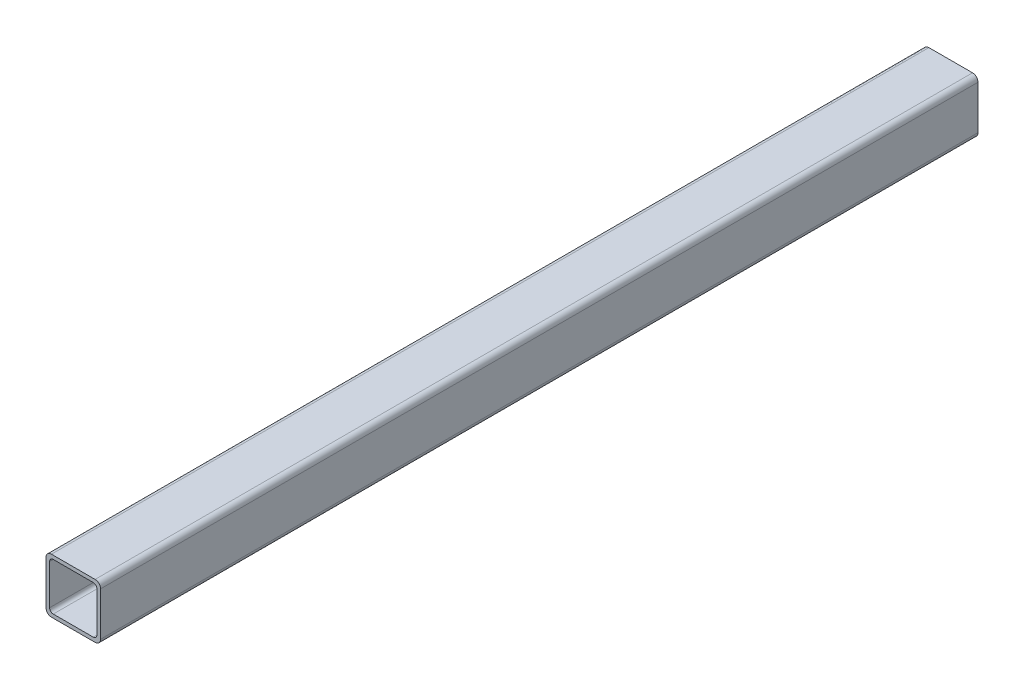
ISO-10303-21;
HEADER;
FILE_DESCRIPTION(('STEP AP214'),'2;1');
FILE_NAME('part.step','',(''),(''),'','','');
FILE_SCHEMA(('AUTOMOTIVE_DESIGN { 1 0 10303 214 1 1 1 1 }'));
ENDSEC;
DATA;
#1=APPLICATION_CONTEXT('core data for automotive mechanical design processes');
#2=APPLICATION_PROTOCOL_DEFINITION('international standard','automotive_design',2000,#1);
#3=PRODUCT_CONTEXT('',#1,'mechanical');
#4=PRODUCT('Part','Part','',(#3));
#5=PRODUCT_RELATED_PRODUCT_CATEGORY('part','',(#4));
#6=PRODUCT_DEFINITION_FORMATION('','',#4);
#7=PRODUCT_DEFINITION_CONTEXT('part definition',#1,'design');
#8=PRODUCT_DEFINITION('design','',#6,#7);
#9=PRODUCT_DEFINITION_SHAPE('','',#8);
#10=(LENGTH_UNIT() NAMED_UNIT(*) SI_UNIT(.MILLI.,.METRE.));
#11=(NAMED_UNIT(*) PLANE_ANGLE_UNIT() SI_UNIT($,.RADIAN.));
#12=(NAMED_UNIT(*) SI_UNIT($,.STERADIAN.) SOLID_ANGLE_UNIT());
#13=UNCERTAINTY_MEASURE_WITH_UNIT(LENGTH_MEASURE(1.E-05),#10,'distance_accuracy_value','');
#14=(GEOMETRIC_REPRESENTATION_CONTEXT(3) GLOBAL_UNCERTAINTY_ASSIGNED_CONTEXT((#13)) GLOBAL_UNIT_ASSIGNED_CONTEXT((#10,
#11,#12)) REPRESENTATION_CONTEXT('',''));
#15=CARTESIAN_POINT('',(0.,0.,0.));
#16=DIRECTION('',(0.,0.,1.));
#17=DIRECTION('',(1.,0.,0.));
#18=AXIS2_PLACEMENT_3D('',#15,#16,#17);
#19=CARTESIAN_POINT('',(-27.,-27.,-482.500000000008));
#20=DIRECTION('',(0.,0.,1.));
#21=DIRECTION('',(1.,0.,0.));
#22=AXIS2_PLACEMENT_3D('',#19,#20,#21);
#23=CYLINDRICAL_SURFACE('',#22,3.);
#24=CARTESIAN_POINT('',(-27.,-27.,0.));
#25=DIRECTION('',(0.,0.,1.));
#26=DIRECTION('',(1.,0.,0.));
#27=AXIS2_PLACEMENT_3D('',#24,#25,#26);
#28=CIRCLE('',#27,3.);
#29=CARTESIAN_POINT('',(-30.,-27.,0.));
#30=VERTEX_POINT('',#29);
#31=CARTESIAN_POINT('',(-27.,-30.,0.));
#32=VERTEX_POINT('',#31);
#33=EDGE_CURVE('E205',#30,#32,#28,.T.);
#34=ORIENTED_EDGE('',*,*,#33,.F.);
#35=DIRECTION('',(0.,0.,1.));
#36=VECTOR('',#35,1.);
#37=CARTESIAN_POINT('',(-30.,-27.,-482.500000000008));
#38=LINE('',#37,#36);
#39=CARTESIAN_POINT('',(-30.,-27.,-482.500000000008));
#40=VERTEX_POINT('',#39);
#41=EDGE_CURVE('E11',#40,#30,#38,.T.);
#42=ORIENTED_EDGE('',*,*,#41,.F.);
#43=CARTESIAN_POINT('',(-27.,-27.,-482.500000000008));
#44=DIRECTION('',(0.,0.,1.));
#45=DIRECTION('',(1.,0.,0.));
#46=AXIS2_PLACEMENT_3D('',#43,#44,#45);
#47=CIRCLE('',#46,3.);
#48=CARTESIAN_POINT('',(-27.,-30.,-482.500000000008));
#49=VERTEX_POINT('',#48);
#50=EDGE_CURVE('E217',#40,#49,#47,.T.);
#51=ORIENTED_EDGE('',*,*,#50,.T.);
#52=DIRECTION('',(0.,0.,1.));
#53=VECTOR('',#52,1.);
#54=CARTESIAN_POINT('',(-27.,-30.,-482.500000000008));
#55=LINE('',#54,#53);
#56=EDGE_CURVE('E38',#49,#32,#55,.T.);
#57=ORIENTED_EDGE('',*,*,#56,.T.);
#58=EDGE_LOOP('',(#34,#42,#51,#57));
#59=FACE_BOUND('',#58,.T.);
#60=ADVANCED_FACE('F35',(#59),#23,.T.);
#61=CARTESIAN_POINT('',(-30.,-3.00000000000002,-482.500000000008));
#62=DIRECTION('',(-1.,0.,0.));
#63=DIRECTION('',(0.,0.,1.));
#64=AXIS2_PLACEMENT_3D('',#61,#62,#63);
#65=PLANE('',#64);
#66=DIRECTION('',(0.,-1.,0.));
#67=VECTOR('',#66,1.);
#68=CARTESIAN_POINT('',(-30.,-3.00000000000002,0.));
#69=LINE('',#68,#67);
#70=CARTESIAN_POINT('',(-30.,-3.00000000000002,0.));
#71=VERTEX_POINT('',#70);
#72=EDGE_CURVE('E221',#71,#30,#69,.T.);
#73=ORIENTED_EDGE('',*,*,#72,.F.);
#74=DIRECTION('',(0.,0.,1.));
#75=VECTOR('',#74,1.);
#76=CARTESIAN_POINT('',(-30.,-3.00000000000002,-482.500000000008));
#77=LINE('',#76,#75);
#78=CARTESIAN_POINT('',(-30.,-3.00000000000002,-482.500000000008));
#79=VERTEX_POINT('',#78);
#80=EDGE_CURVE('E43',#79,#71,#77,.T.);
#81=ORIENTED_EDGE('',*,*,#80,.F.);
#82=DIRECTION('',(0.,-1.,0.));
#83=VECTOR('',#82,1.);
#84=CARTESIAN_POINT('',(-30.,-3.00000000000002,-482.500000000008));
#85=LINE('',#84,#83);
#86=EDGE_CURVE('E239',#79,#40,#85,.T.);
#87=ORIENTED_EDGE('',*,*,#86,.T.);
#88=ORIENTED_EDGE('',*,*,#41,.T.);
#89=EDGE_LOOP('',(#73,#81,#87,#88));
#90=FACE_BOUND('',#89,.T.);
#91=ADVANCED_FACE('F286',(#90),#65,.T.);
#92=CARTESIAN_POINT('',(-27.,-3.,-482.500000000008));
#93=DIRECTION('',(0.,0.,1.));
#94=DIRECTION('',(1.,0.,0.));
#95=AXIS2_PLACEMENT_3D('',#92,#93,#94);
#96=CYLINDRICAL_SURFACE('',#95,3.);
#97=CARTESIAN_POINT('',(-27.,-3.,0.));
#98=DIRECTION('',(0.,0.,1.));
#99=DIRECTION('',(1.,0.,0.));
#100=AXIS2_PLACEMENT_3D('',#97,#98,#99);
#101=CIRCLE('',#100,3.);
#102=CARTESIAN_POINT('',(-27.,0.,0.));
#103=VERTEX_POINT('',#102);
#104=EDGE_CURVE('E259',#103,#71,#101,.T.);
#105=ORIENTED_EDGE('',*,*,#104,.F.);
#106=DIRECTION('',(0.,0.,1.));
#107=VECTOR('',#106,1.);
#108=CARTESIAN_POINT('',(-27.,0.,-482.500000000008));
#109=LINE('',#108,#107);
#110=CARTESIAN_POINT('',(-27.,0.,-482.500000000008));
#111=VERTEX_POINT('',#110);
#112=EDGE_CURVE('E265',#111,#103,#109,.T.);
#113=ORIENTED_EDGE('',*,*,#112,.F.);
#114=CARTESIAN_POINT('',(-27.,-3.,-482.500000000008));
#115=DIRECTION('',(0.,0.,1.));
#116=DIRECTION('',(1.,0.,0.));
#117=AXIS2_PLACEMENT_3D('',#114,#115,#116);
#118=CIRCLE('',#117,3.);
#119=EDGE_CURVE('E236',#111,#79,#118,.T.);
#120=ORIENTED_EDGE('',*,*,#119,.T.);
#121=ORIENTED_EDGE('',*,*,#80,.T.);
#122=EDGE_LOOP('',(#105,#113,#120,#121));
#123=FACE_BOUND('',#122,.T.);
#124=ADVANCED_FACE('F305',(#123),#96,.T.);
#125=CARTESIAN_POINT('',(-27.,0.,-482.500000000008));
#126=DIRECTION('',(0.,1.,0.));
#127=DIRECTION('',(0.,0.,1.));
#128=AXIS2_PLACEMENT_3D('',#125,#126,#127);
#129=PLANE('',#128);
#130=DIRECTION('',(-1.,0.,0.));
#131=VECTOR('',#130,1.);
#132=CARTESIAN_POINT('',(-27.,0.,0.));
#133=LINE('',#132,#131);
#134=CARTESIAN_POINT('',(-3.,0.,0.));
#135=VERTEX_POINT('',#134);
#136=EDGE_CURVE('E256',#135,#103,#133,.T.);
#137=ORIENTED_EDGE('',*,*,#136,.F.);
#138=DIRECTION('',(0.,0.,1.));
#139=VECTOR('',#138,1.);
#140=CARTESIAN_POINT('',(-3.,0.,-482.500000000008));
#141=LINE('',#140,#139);
#142=CARTESIAN_POINT('',(-3.,0.,-482.500000000008));
#143=VERTEX_POINT('',#142);
#144=EDGE_CURVE('E267',#143,#135,#141,.T.);
#145=ORIENTED_EDGE('',*,*,#144,.F.);
#146=DIRECTION('',(-1.,0.,0.));
#147=VECTOR('',#146,1.);
#148=CARTESIAN_POINT('',(-27.,0.,-482.500000000008));
#149=LINE('',#148,#147);
#150=EDGE_CURVE('E233',#143,#111,#149,.T.);
#151=ORIENTED_EDGE('',*,*,#150,.T.);
#152=ORIENTED_EDGE('',*,*,#112,.T.);
#153=EDGE_LOOP('',(#137,#145,#151,#152));
#154=FACE_BOUND('',#153,.T.);
#155=ADVANCED_FACE('F303',(#154),#129,.T.);
#156=CARTESIAN_POINT('',(-3.,-3.,-482.500000000008));
#157=DIRECTION('',(0.,0.,1.));
#158=DIRECTION('',(1.,0.,0.));
#159=AXIS2_PLACEMENT_3D('',#156,#157,#158);
#160=CYLINDRICAL_SURFACE('',#159,3.);
#161=CARTESIAN_POINT('',(-3.,-3.,0.));
#162=DIRECTION('',(0.,0.,1.));
#163=DIRECTION('',(-1.,0.,0.));
#164=AXIS2_PLACEMENT_3D('',#161,#162,#163);
#165=CIRCLE('',#164,3.);
#166=CARTESIAN_POINT('',(0.,-3.,0.));
#167=VERTEX_POINT('',#166);
#168=EDGE_CURVE('E253',#167,#135,#165,.T.);
#169=ORIENTED_EDGE('',*,*,#168,.F.);
#170=DIRECTION('',(0.,0.,1.));
#171=VECTOR('',#170,1.);
#172=CARTESIAN_POINT('',(0.,-3.,-482.500000000008));
#173=LINE('',#172,#171);
#174=CARTESIAN_POINT('',(0.,-3.,-482.500000000008));
#175=VERTEX_POINT('',#174);
#176=EDGE_CURVE('E269',#175,#167,#173,.T.);
#177=ORIENTED_EDGE('',*,*,#176,.F.);
#178=CARTESIAN_POINT('',(-3.,-3.,-482.500000000008));
#179=DIRECTION('',(0.,0.,1.));
#180=DIRECTION('',(-1.,0.,0.));
#181=AXIS2_PLACEMENT_3D('',#178,#179,#180);
#182=CIRCLE('',#181,3.);
#183=EDGE_CURVE('E230',#175,#143,#182,.T.);
#184=ORIENTED_EDGE('',*,*,#183,.T.);
#185=ORIENTED_EDGE('',*,*,#144,.T.);
#186=EDGE_LOOP('',(#169,#177,#184,#185));
#187=FACE_BOUND('',#186,.T.);
#188=ADVANCED_FACE('F299',(#187),#160,.T.);
#189=CARTESIAN_POINT('',(0.,-3.,-482.500000000008));
#190=DIRECTION('',(1.,0.,0.));
#191=DIRECTION('',(0.,1.,0.));
#192=AXIS2_PLACEMENT_3D('',#189,#190,#191);
#193=PLANE('',#192);
#194=DIRECTION('',(0.,1.,0.));
#195=VECTOR('',#194,1.);
#196=CARTESIAN_POINT('',(0.,-3.,0.));
#197=LINE('',#196,#195);
#198=CARTESIAN_POINT('',(0.,-27.,0.));
#199=VERTEX_POINT('',#198);
#200=EDGE_CURVE('E250',#199,#167,#197,.T.);
#201=ORIENTED_EDGE('',*,*,#200,.F.);
#202=DIRECTION('',(0.,0.,1.));
#203=VECTOR('',#202,1.);
#204=CARTESIAN_POINT('',(0.,-27.,-482.500000000008));
#205=LINE('',#204,#203);
#206=CARTESIAN_POINT('',(0.,-27.,-482.500000000008));
#207=VERTEX_POINT('',#206);
#208=EDGE_CURVE('E271',#207,#199,#205,.T.);
#209=ORIENTED_EDGE('',*,*,#208,.F.);
#210=DIRECTION('',(0.,1.,0.));
#211=VECTOR('',#210,1.);
#212=CARTESIAN_POINT('',(0.,-3.,-482.500000000008));
#213=LINE('',#212,#211);
#214=EDGE_CURVE('E227',#207,#175,#213,.T.);
#215=ORIENTED_EDGE('',*,*,#214,.T.);
#216=ORIENTED_EDGE('',*,*,#176,.T.);
#217=EDGE_LOOP('',(#201,#209,#215,#216));
#218=FACE_BOUND('',#217,.T.);
#219=ADVANCED_FACE('F297',(#218),#193,.T.);
#220=CARTESIAN_POINT('',(-2.99999999999999,-27.,-482.500000000008));
#221=DIRECTION('',(0.,0.,1.));
#222=DIRECTION('',(1.,0.,0.));
#223=AXIS2_PLACEMENT_3D('',#220,#221,#222);
#224=CYLINDRICAL_SURFACE('',#223,3.);
#225=CARTESIAN_POINT('',(-2.99999999999999,-27.,0.));
#226=DIRECTION('',(0.,0.,1.));
#227=DIRECTION('',(1.,0.,0.));
#228=AXIS2_PLACEMENT_3D('',#225,#226,#227);
#229=CIRCLE('',#228,3.);
#230=CARTESIAN_POINT('',(-2.99999999999999,-30.,0.));
#231=VERTEX_POINT('',#230);
#232=EDGE_CURVE('E247',#231,#199,#229,.T.);
#233=ORIENTED_EDGE('',*,*,#232,.F.);
#234=DIRECTION('',(0.,0.,1.));
#235=VECTOR('',#234,1.);
#236=CARTESIAN_POINT('',(-2.99999999999999,-30.,-482.500000000008));
#237=LINE('',#236,#235);
#238=CARTESIAN_POINT('',(-2.99999999999999,-30.,-482.500000000008));
#239=VERTEX_POINT('',#238);
#240=EDGE_CURVE('E272',#239,#231,#237,.T.);
#241=ORIENTED_EDGE('',*,*,#240,.F.);
#242=CARTESIAN_POINT('',(-2.99999999999999,-27.,-482.500000000008));
#243=DIRECTION('',(0.,0.,1.));
#244=DIRECTION('',(1.,0.,0.));
#245=AXIS2_PLACEMENT_3D('',#242,#243,#244);
#246=CIRCLE('',#245,3.);
#247=EDGE_CURVE('E224',#239,#207,#246,.T.);
#248=ORIENTED_EDGE('',*,*,#247,.T.);
#249=ORIENTED_EDGE('',*,*,#208,.T.);
#250=EDGE_LOOP('',(#233,#241,#248,#249));
#251=FACE_BOUND('',#250,.T.);
#252=ADVANCED_FACE('F293',(#251),#224,.T.);
#253=CARTESIAN_POINT('',(-27.,-30.,-482.500000000008));
#254=DIRECTION('',(0.,-1.,0.));
#255=DIRECTION('',(1.,0.,0.));
#256=AXIS2_PLACEMENT_3D('',#253,#254,#255);
#257=PLANE('',#256);
#258=DIRECTION('',(1.,0.,0.));
#259=VECTOR('',#258,1.);
#260=CARTESIAN_POINT('',(-27.,-30.,0.));
#261=LINE('',#260,#259);
#262=EDGE_CURVE('E244',#32,#231,#261,.T.);
#263=ORIENTED_EDGE('',*,*,#262,.F.);
#264=ORIENTED_EDGE('',*,*,#56,.F.);
#265=DIRECTION('',(1.,0.,0.));
#266=VECTOR('',#265,1.);
#267=CARTESIAN_POINT('',(-27.,-30.,-482.500000000008));
#268=LINE('',#267,#266);
#269=EDGE_CURVE('E220',#49,#239,#268,.T.);
#270=ORIENTED_EDGE('',*,*,#269,.T.);
#271=ORIENTED_EDGE('',*,*,#240,.T.);
#272=EDGE_LOOP('',(#263,#264,#270,#271));
#273=FACE_BOUND('',#272,.T.);
#274=ADVANCED_FACE('F280',(#273),#257,.T.);
#275=CARTESIAN_POINT('',(-27.,-27.,-482.500000000008));
#276=DIRECTION('',(0.,0.,1.));
#277=DIRECTION('',(1.,0.,0.));
#278=AXIS2_PLACEMENT_3D('',#275,#276,#277);
#279=PLANE('',#278);
#280=DIRECTION('',(0.,-1.,0.));
#281=VECTOR('',#280,1.);
#282=CARTESIAN_POINT('',(-28.,-4.00000000000002,-482.500000000008));
#283=LINE('',#282,#281);
#284=CARTESIAN_POINT('',(-28.,-4.00000000000002,-482.500000000008));
#285=VERTEX_POINT('',#284);
#286=CARTESIAN_POINT('',(-28.,-26.,-482.500000000008));
#287=VERTEX_POINT('',#286);
#288=EDGE_CURVE('E156',#285,#287,#283,.T.);
#289=ORIENTED_EDGE('',*,*,#288,.T.);
#290=CARTESIAN_POINT('',(-26.,-26.,-482.500000000008));
#291=DIRECTION('',(0.,0.,1.));
#292=DIRECTION('',(1.,0.,0.));
#293=AXIS2_PLACEMENT_3D('',#290,#291,#292);
#294=CIRCLE('',#293,2.);
#295=CARTESIAN_POINT('',(-26.,-28.,-482.500000000008));
#296=VERTEX_POINT('',#295);
#297=EDGE_CURVE('E150',#287,#296,#294,.T.);
#298=ORIENTED_EDGE('',*,*,#297,.T.);
#299=DIRECTION('',(1.,0.,0.));
#300=VECTOR('',#299,1.);
#301=CARTESIAN_POINT('',(-26.,-28.,-482.500000000008));
#302=LINE('',#301,#300);
#303=CARTESIAN_POINT('',(-4.00000000000001,-28.,-482.500000000008));
#304=VERTEX_POINT('',#303);
#305=EDGE_CURVE('E159',#296,#304,#302,.T.);
#306=ORIENTED_EDGE('',*,*,#305,.T.);
#307=CARTESIAN_POINT('',(-3.99999999999999,-26.,-482.500000000008));
#308=DIRECTION('',(0.,0.,1.));
#309=DIRECTION('',(1.,0.,0.));
#310=AXIS2_PLACEMENT_3D('',#307,#308,#309);
#311=CIRCLE('',#310,2.);
#312=CARTESIAN_POINT('',(-1.99999999999999,-26.,-482.500000000008));
#313=VERTEX_POINT('',#312);
#314=EDGE_CURVE('E51',#304,#313,#311,.T.);
#315=ORIENTED_EDGE('',*,*,#314,.T.);
#316=DIRECTION('',(0.,1.,0.));
#317=VECTOR('',#316,1.);
#318=CARTESIAN_POINT('',(-1.99999999999999,-4.00000000000002,-482.500000000008));
#319=LINE('',#318,#317);
#320=CARTESIAN_POINT('',(-1.99999999999999,-4.00000000000002,-482.500000000008));
#321=VERTEX_POINT('',#320);
#322=EDGE_CURVE('E174',#313,#321,#319,.T.);
#323=ORIENTED_EDGE('',*,*,#322,.T.);
#324=CARTESIAN_POINT('',(-3.99999999999999,-4.,-482.500000000008));
#325=DIRECTION('',(0.,0.,1.));
#326=DIRECTION('',(-1.,0.,0.));
#327=AXIS2_PLACEMENT_3D('',#324,#325,#326);
#328=CIRCLE('',#327,2.);
#329=CARTESIAN_POINT('',(-4.00000000000001,-2.,-482.500000000008));
#330=VERTEX_POINT('',#329);
#331=EDGE_CURVE('E177',#321,#330,#328,.T.);
#332=ORIENTED_EDGE('',*,*,#331,.T.);
#333=DIRECTION('',(-1.,0.,0.));
#334=VECTOR('',#333,1.);
#335=CARTESIAN_POINT('',(-26.,-2.,-482.500000000008));
#336=LINE('',#335,#334);
#337=CARTESIAN_POINT('',(-26.,-2.,-482.500000000008));
#338=VERTEX_POINT('',#337);
#339=EDGE_CURVE('E180',#330,#338,#336,.T.);
#340=ORIENTED_EDGE('',*,*,#339,.T.);
#341=CARTESIAN_POINT('',(-26.,-4.,-482.500000000008));
#342=DIRECTION('',(0.,0.,1.));
#343=DIRECTION('',(1.,0.,0.));
#344=AXIS2_PLACEMENT_3D('',#341,#342,#343);
#345=CIRCLE('',#344,2.);
#346=EDGE_CURVE('E183',#338,#285,#345,.T.);
#347=ORIENTED_EDGE('',*,*,#346,.T.);
#348=EDGE_LOOP('',(#289,#298,#306,#315,#323,#332,#340,#347));
#349=FACE_BOUND('',#348,.T.);
#350=ORIENTED_EDGE('',*,*,#50,.F.);
#351=ORIENTED_EDGE('',*,*,#86,.F.);
#352=ORIENTED_EDGE('',*,*,#119,.F.);
#353=ORIENTED_EDGE('',*,*,#150,.F.);
#354=ORIENTED_EDGE('',*,*,#183,.F.);
#355=ORIENTED_EDGE('',*,*,#214,.F.);
#356=ORIENTED_EDGE('',*,*,#247,.F.);
#357=ORIENTED_EDGE('',*,*,#269,.F.);
#358=EDGE_LOOP('',(#350,#351,#352,#353,#354,#355,#356,#357));
#359=FACE_BOUND('',#358,.T.);
#360=ADVANCED_FACE('F163',(#349,#359),#279,.F.);
#361=CARTESIAN_POINT('',(-27.,-27.,0.));
#362=DIRECTION('',(0.,0.,1.));
#363=DIRECTION('',(1.,0.,0.));
#364=AXIS2_PLACEMENT_3D('',#361,#362,#363);
#365=PLANE('',#364);
#366=CARTESIAN_POINT('',(-26.,-26.,0.));
#367=DIRECTION('',(0.,0.,1.));
#368=DIRECTION('',(1.,0.,0.));
#369=AXIS2_PLACEMENT_3D('',#366,#367,#368);
#370=CIRCLE('',#369,2.);
#371=CARTESIAN_POINT('',(-28.,-26.,0.));
#372=VERTEX_POINT('',#371);
#373=CARTESIAN_POINT('',(-26.,-28.,0.));
#374=VERTEX_POINT('',#373);
#375=EDGE_CURVE('E59',#372,#374,#370,.T.);
#376=ORIENTED_EDGE('',*,*,#375,.F.);
#377=DIRECTION('',(0.,-1.,0.));
#378=VECTOR('',#377,1.);
#379=CARTESIAN_POINT('',(-28.,-4.00000000000002,0.));
#380=LINE('',#379,#378);
#381=CARTESIAN_POINT('',(-28.,-4.00000000000002,0.));
#382=VERTEX_POINT('',#381);
#383=EDGE_CURVE('E167',#382,#372,#380,.T.);
#384=ORIENTED_EDGE('',*,*,#383,.F.);
#385=CARTESIAN_POINT('',(-26.,-4.,0.));
#386=DIRECTION('',(0.,0.,1.));
#387=DIRECTION('',(1.,0.,0.));
#388=AXIS2_PLACEMENT_3D('',#385,#386,#387);
#389=CIRCLE('',#388,2.);
#390=CARTESIAN_POINT('',(-26.,-2.,0.));
#391=VERTEX_POINT('',#390);
#392=EDGE_CURVE('E170',#391,#382,#389,.T.);
#393=ORIENTED_EDGE('',*,*,#392,.F.);
#394=DIRECTION('',(-1.,0.,0.));
#395=VECTOR('',#394,1.);
#396=CARTESIAN_POINT('',(-26.,-2.,0.));
#397=LINE('',#396,#395);
#398=CARTESIAN_POINT('',(-4.00000000000001,-2.,0.));
#399=VERTEX_POINT('',#398);
#400=EDGE_CURVE('E198',#399,#391,#397,.T.);
#401=ORIENTED_EDGE('',*,*,#400,.F.);
#402=CARTESIAN_POINT('',(-3.99999999999999,-4.,0.));
#403=DIRECTION('',(0.,0.,1.));
#404=DIRECTION('',(-1.,0.,0.));
#405=AXIS2_PLACEMENT_3D('',#402,#403,#404);
#406=CIRCLE('',#405,2.);
#407=CARTESIAN_POINT('',(-1.99999999999999,-4.00000000000002,0.));
#408=VERTEX_POINT('',#407);
#409=EDGE_CURVE('E195',#408,#399,#406,.T.);
#410=ORIENTED_EDGE('',*,*,#409,.F.);
#411=DIRECTION('',(0.,1.,0.));
#412=VECTOR('',#411,1.);
#413=CARTESIAN_POINT('',(-1.99999999999999,-4.00000000000002,0.));
#414=LINE('',#413,#412);
#415=CARTESIAN_POINT('',(-1.99999999999999,-26.,0.));
#416=VERTEX_POINT('',#415);
#417=EDGE_CURVE('E192',#416,#408,#414,.T.);
#418=ORIENTED_EDGE('',*,*,#417,.F.);
#419=CARTESIAN_POINT('',(-3.99999999999999,-26.,0.));
#420=DIRECTION('',(0.,0.,1.));
#421=DIRECTION('',(1.,0.,0.));
#422=AXIS2_PLACEMENT_3D('',#419,#420,#421);
#423=CIRCLE('',#422,2.);
#424=CARTESIAN_POINT('',(-4.00000000000001,-28.,0.));
#425=VERTEX_POINT('',#424);
#426=EDGE_CURVE('E189',#425,#416,#423,.T.);
#427=ORIENTED_EDGE('',*,*,#426,.F.);
#428=DIRECTION('',(1.,0.,0.));
#429=VECTOR('',#428,1.);
#430=CARTESIAN_POINT('',(-26.,-28.,0.));
#431=LINE('',#430,#429);
#432=EDGE_CURVE('E187',#374,#425,#431,.T.);
#433=ORIENTED_EDGE('',*,*,#432,.F.);
#434=EDGE_LOOP('',(#376,#384,#393,#401,#410,#418,#427,#433));
#435=FACE_BOUND('',#434,.T.);
#436=ORIENTED_EDGE('',*,*,#33,.T.);
#437=ORIENTED_EDGE('',*,*,#262,.T.);
#438=ORIENTED_EDGE('',*,*,#232,.T.);
#439=ORIENTED_EDGE('',*,*,#200,.T.);
#440=ORIENTED_EDGE('',*,*,#168,.T.);
#441=ORIENTED_EDGE('',*,*,#136,.T.);
#442=ORIENTED_EDGE('',*,*,#104,.T.);
#443=ORIENTED_EDGE('',*,*,#72,.T.);
#444=EDGE_LOOP('',(#436,#437,#438,#439,#440,#441,#442,#443));
#445=FACE_BOUND('',#444,.T.);
#446=ADVANCED_FACE('F282',(#435,#445),#365,.T.);
#447=CARTESIAN_POINT('',(-26.,-26.,-482.500000000008));
#448=DIRECTION('',(0.,0.,1.));
#449=DIRECTION('',(1.,0.,0.));
#450=AXIS2_PLACEMENT_3D('',#447,#448,#449);
#451=CYLINDRICAL_SURFACE('',#450,2.);
#452=ORIENTED_EDGE('',*,*,#375,.T.);
#453=DIRECTION('',(0.,0.,1.));
#454=VECTOR('',#453,1.);
#455=CARTESIAN_POINT('',(-26.,-28.,-482.500000000008));
#456=LINE('',#455,#454);
#457=EDGE_CURVE('E146',#296,#374,#456,.T.);
#458=ORIENTED_EDGE('',*,*,#457,.F.);
#459=ORIENTED_EDGE('',*,*,#297,.F.);
#460=DIRECTION('',(0.,0.,1.));
#461=VECTOR('',#460,1.);
#462=CARTESIAN_POINT('',(-28.,-26.,-482.500000000008));
#463=LINE('',#462,#461);
#464=EDGE_CURVE('E203',#287,#372,#463,.T.);
#465=ORIENTED_EDGE('',*,*,#464,.T.);
#466=EDGE_LOOP('',(#452,#458,#459,#465));
#467=FACE_BOUND('',#466,.T.);
#468=ADVANCED_FACE('F148',(#467),#451,.F.);
#469=CARTESIAN_POINT('',(-28.,-4.00000000000002,-482.500000000008));
#470=DIRECTION('',(-1.,0.,0.));
#471=DIRECTION('',(0.,0.,1.));
#472=AXIS2_PLACEMENT_3D('',#469,#470,#471);
#473=PLANE('',#472);
#474=ORIENTED_EDGE('',*,*,#383,.T.);
#475=ORIENTED_EDGE('',*,*,#464,.F.);
#476=ORIENTED_EDGE('',*,*,#288,.F.);
#477=DIRECTION('',(0.,0.,1.));
#478=VECTOR('',#477,1.);
#479=CARTESIAN_POINT('',(-28.,-4.00000000000002,-482.500000000008));
#480=LINE('',#479,#478);
#481=EDGE_CURVE('E206',#285,#382,#480,.T.);
#482=ORIENTED_EDGE('',*,*,#481,.T.);
#483=EDGE_LOOP('',(#474,#475,#476,#482));
#484=FACE_BOUND('',#483,.T.);
#485=ADVANCED_FACE('F388',(#484),#473,.F.);
#486=CARTESIAN_POINT('',(-26.,-4.,-482.500000000008));
#487=DIRECTION('',(0.,0.,1.));
#488=DIRECTION('',(1.,0.,0.));
#489=AXIS2_PLACEMENT_3D('',#486,#487,#488);
#490=CYLINDRICAL_SURFACE('',#489,2.);
#491=ORIENTED_EDGE('',*,*,#392,.T.);
#492=ORIENTED_EDGE('',*,*,#481,.F.);
#493=ORIENTED_EDGE('',*,*,#346,.F.);
#494=DIRECTION('',(0.,0.,1.));
#495=VECTOR('',#494,1.);
#496=CARTESIAN_POINT('',(-26.,-2.,-482.500000000008));
#497=LINE('',#496,#495);
#498=EDGE_CURVE('E208',#338,#391,#497,.T.);
#499=ORIENTED_EDGE('',*,*,#498,.T.);
#500=EDGE_LOOP('',(#491,#492,#493,#499));
#501=FACE_BOUND('',#500,.T.);
#502=ADVANCED_FACE('F397',(#501),#490,.F.);
#503=CARTESIAN_POINT('',(-26.,-2.,-482.500000000008));
#504=DIRECTION('',(0.,1.,0.));
#505=DIRECTION('',(0.,0.,1.));
#506=AXIS2_PLACEMENT_3D('',#503,#504,#505);
#507=PLANE('',#506);
#508=ORIENTED_EDGE('',*,*,#400,.T.);
#509=ORIENTED_EDGE('',*,*,#498,.F.);
#510=ORIENTED_EDGE('',*,*,#339,.F.);
#511=DIRECTION('',(0.,0.,1.));
#512=VECTOR('',#511,1.);
#513=CARTESIAN_POINT('',(-4.00000000000001,-2.,-482.500000000008));
#514=LINE('',#513,#512);
#515=EDGE_CURVE('E210',#330,#399,#514,.T.);
#516=ORIENTED_EDGE('',*,*,#515,.T.);
#517=EDGE_LOOP('',(#508,#509,#510,#516));
#518=FACE_BOUND('',#517,.T.);
#519=ADVANCED_FACE('F407',(#518),#507,.F.);
#520=CARTESIAN_POINT('',(-3.99999999999999,-4.,-482.500000000008));
#521=DIRECTION('',(0.,0.,1.));
#522=DIRECTION('',(1.,0.,0.));
#523=AXIS2_PLACEMENT_3D('',#520,#521,#522);
#524=CYLINDRICAL_SURFACE('',#523,2.);
#525=ORIENTED_EDGE('',*,*,#409,.T.);
#526=ORIENTED_EDGE('',*,*,#515,.F.);
#527=ORIENTED_EDGE('',*,*,#331,.F.);
#528=DIRECTION('',(0.,0.,1.));
#529=VECTOR('',#528,1.);
#530=CARTESIAN_POINT('',(-1.99999999999999,-4.00000000000002,-482.500000000008));
#531=LINE('',#530,#529);
#532=EDGE_CURVE('E212',#321,#408,#531,.T.);
#533=ORIENTED_EDGE('',*,*,#532,.T.);
#534=EDGE_LOOP('',(#525,#526,#527,#533));
#535=FACE_BOUND('',#534,.T.);
#536=ADVANCED_FACE('F417',(#535),#524,.F.);
#537=CARTESIAN_POINT('',(-1.99999999999999,-4.00000000000002,-482.500000000008));
#538=DIRECTION('',(1.,0.,0.));
#539=DIRECTION('',(0.,0.,-1.));
#540=AXIS2_PLACEMENT_3D('',#537,#538,#539);
#541=PLANE('',#540);
#542=ORIENTED_EDGE('',*,*,#417,.T.);
#543=ORIENTED_EDGE('',*,*,#532,.F.);
#544=ORIENTED_EDGE('',*,*,#322,.F.);
#545=DIRECTION('',(0.,0.,1.));
#546=VECTOR('',#545,1.);
#547=CARTESIAN_POINT('',(-1.99999999999999,-26.,-482.500000000008));
#548=LINE('',#547,#546);
#549=EDGE_CURVE('E214',#313,#416,#548,.T.);
#550=ORIENTED_EDGE('',*,*,#549,.T.);
#551=EDGE_LOOP('',(#542,#543,#544,#550));
#552=FACE_BOUND('',#551,.T.);
#553=ADVANCED_FACE('F427',(#552),#541,.F.);
#554=CARTESIAN_POINT('',(-3.99999999999999,-26.,-482.500000000008));
#555=DIRECTION('',(0.,0.,1.));
#556=DIRECTION('',(1.,0.,0.));
#557=AXIS2_PLACEMENT_3D('',#554,#555,#556);
#558=CYLINDRICAL_SURFACE('',#557,2.);
#559=ORIENTED_EDGE('',*,*,#426,.T.);
#560=ORIENTED_EDGE('',*,*,#549,.F.);
#561=ORIENTED_EDGE('',*,*,#314,.F.);
#562=DIRECTION('',(0.,0.,1.));
#563=VECTOR('',#562,1.);
#564=CARTESIAN_POINT('',(-4.00000000000001,-28.,-482.500000000008));
#565=LINE('',#564,#563);
#566=EDGE_CURVE('E155',#304,#425,#565,.T.);
#567=ORIENTED_EDGE('',*,*,#566,.T.);
#568=EDGE_LOOP('',(#559,#560,#561,#567));
#569=FACE_BOUND('',#568,.T.);
#570=ADVANCED_FACE('F437',(#569),#558,.F.);
#571=CARTESIAN_POINT('',(-26.,-28.,-482.500000000008));
#572=DIRECTION('',(0.,-1.,0.));
#573=DIRECTION('',(0.,0.,-1.));
#574=AXIS2_PLACEMENT_3D('',#571,#572,#573);
#575=PLANE('',#574);
#576=ORIENTED_EDGE('',*,*,#432,.T.);
#577=ORIENTED_EDGE('',*,*,#566,.F.);
#578=ORIENTED_EDGE('',*,*,#305,.F.);
#579=ORIENTED_EDGE('',*,*,#457,.T.);
#580=EDGE_LOOP('',(#576,#577,#578,#579));
#581=FACE_BOUND('',#580,.T.);
#582=ADVANCED_FACE('F160',(#581),#575,.F.);
#583=CLOSED_SHELL('',(#60,#91,#124,#155,#188,#219,#252,#274,#360,#446,#468,#485,#502,#519,#536,
#553,#570,#582));
#584=MANIFOLD_SOLID_BREP('B2',#583);
#585=ADVANCED_BREP_SHAPE_REPRESENTATION('',(#18,#584),#14);
#586=SHAPE_DEFINITION_REPRESENTATION(#9,#585);
ENDSEC;
END-ISO-10303-21;
